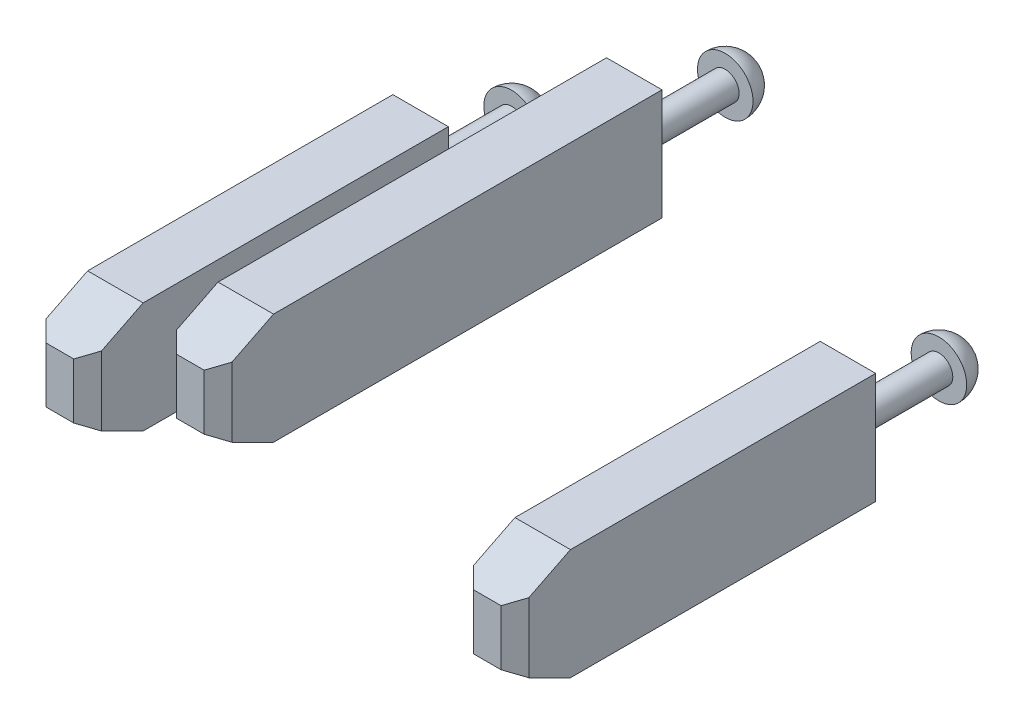
ISO-10303-21;
HEADER;
FILE_DESCRIPTION(('STEP AP214'),'2;1');
FILE_NAME('part.step','',(''),(''),'','','');
FILE_SCHEMA(('AUTOMOTIVE_DESIGN { 1 0 10303 214 1 1 1 1 }'));
ENDSEC;
DATA;
#1=APPLICATION_CONTEXT('core data for automotive mechanical design processes');
#2=APPLICATION_PROTOCOL_DEFINITION('international standard','automotive_design',2000,#1);
#3=PRODUCT_CONTEXT('',#1,'mechanical');
#4=PRODUCT('Part','Part','',(#3));
#5=PRODUCT_RELATED_PRODUCT_CATEGORY('part','',(#4));
#6=PRODUCT_DEFINITION_FORMATION('','',#4);
#7=PRODUCT_DEFINITION_CONTEXT('part definition',#1,'design');
#8=PRODUCT_DEFINITION('design','',#6,#7);
#9=PRODUCT_DEFINITION_SHAPE('','',#8);
#10=(LENGTH_UNIT() NAMED_UNIT(*) SI_UNIT(.MILLI.,.METRE.));
#11=(NAMED_UNIT(*) PLANE_ANGLE_UNIT() SI_UNIT($,.RADIAN.));
#12=(NAMED_UNIT(*) SI_UNIT($,.STERADIAN.) SOLID_ANGLE_UNIT());
#13=UNCERTAINTY_MEASURE_WITH_UNIT(LENGTH_MEASURE(1.E-05),#10,'distance_accuracy_value','');
#14=(GEOMETRIC_REPRESENTATION_CONTEXT(3) GLOBAL_UNCERTAINTY_ASSIGNED_CONTEXT((#13)) GLOBAL_UNIT_ASSIGNED_CONTEXT((#10,
#11,#12)) REPRESENTATION_CONTEXT('',''));
#15=CARTESIAN_POINT('',(0.,0.,0.));
#16=DIRECTION('',(0.,0.,1.));
#17=DIRECTION('',(1.,0.,0.));
#18=AXIS2_PLACEMENT_3D('',#15,#16,#17);
#19=CARTESIAN_POINT('',(0.,17.8125,-19.7484375));
#20=DIRECTION('',(1.,0.,0.));
#21=DIRECTION('',(0.,1.,0.));
#22=AXIS2_PLACEMENT_3D('',#19,#20,#21);
#23=SPHERICAL_SURFACE('',#22,1.);
#24=CARTESIAN_POINT('',(0.,17.8125,-19.7484375));
#25=DIRECTION('',(0.,0.,1.));
#26=DIRECTION('',(1.,0.,0.));
#27=AXIS2_PLACEMENT_3D('',#24,#25,#26);
#28=CIRCLE('',#27,1.);
#29=CARTESIAN_POINT('',(1.,17.8125,-19.7484375));
#30=VERTEX_POINT('',#29);
#31=CARTESIAN_POINT('',(-1.,17.8125,-19.7484375));
#32=VERTEX_POINT('',#31);
#33=EDGE_CURVE('P0_E32',#30,#32,#28,.T.);
#34=ORIENTED_EDGE('',*,*,#33,.F.);
#35=CARTESIAN_POINT('',(0.,17.8125,-19.7484375));
#36=DIRECTION('',(0.,0.,1.));
#37=DIRECTION('',(1.,0.,0.));
#38=AXIS2_PLACEMENT_3D('',#35,#36,#37);
#39=CIRCLE('',#38,1.);
#40=EDGE_CURVE('P0_E20',#32,#30,#39,.T.);
#41=ORIENTED_EDGE('',*,*,#40,.F.);
#42=EDGE_LOOP('',(#34,#41));
#43=FACE_BOUND('',#42,.T.);
#44=ADVANCED_FACE('P0_F16',(#43),#23,.T.);
#45=CARTESIAN_POINT('',(0.,17.8125,-19.7484375));
#46=DIRECTION('',(0.,0.,1.));
#47=DIRECTION('',(1.,0.,0.));
#48=AXIS2_PLACEMENT_3D('',#45,#46,#47);
#49=PLANE('',#48);
#50=CARTESIAN_POINT('',(0.,17.8125,-19.7484375));
#51=DIRECTION('',(0.,0.,-1.));
#52=DIRECTION('',(-1.,0.,0.));
#53=AXIS2_PLACEMENT_3D('',#50,#51,#52);
#54=CIRCLE('',#53,0.5);
#55=CARTESIAN_POINT('',(-0.5,17.8125,-19.7484375));
#56=VERTEX_POINT('',#55);
#57=EDGE_CURVE('P0_E147',#56,#56,#54,.F.);
#58=ORIENTED_EDGE('',*,*,#57,.F.);
#59=EDGE_LOOP('',(#58));
#60=FACE_BOUND('',#59,.T.);
#61=ORIENTED_EDGE('',*,*,#33,.T.);
#62=ORIENTED_EDGE('',*,*,#40,.T.);
#63=EDGE_LOOP('',(#61,#62));
#64=FACE_BOUND('',#63,.T.);
#65=ADVANCED_FACE('P0_F163',(#60,#64),#49,.T.);
#66=CARTESIAN_POINT('',(-0.75,18.8125,-0.720312500000001));
#67=DIRECTION('',(-0.707106781186548,0.,0.707106781186547));
#68=DIRECTION('',(0.707106781186547,0.,0.707106781186548));
#69=AXIS2_PLACEMENT_3D('',#66,#67,#68);
#70=PLANE('',#69);
#71=DIRECTION('',(0.666666666666667,-0.333333333333333,0.666666666666666));
#72=VECTOR('',#71,1.);
#73=CARTESIAN_POINT('',(-1.,19.0625,-0.9703125));
#74=LINE('',#73,#72);
#75=CARTESIAN_POINT('',(-1.,19.0625,-0.970312500000001));
#76=VERTEX_POINT('',#75);
#77=CARTESIAN_POINT('',(-0.5,18.8125,-0.470312500000001));
#78=VERTEX_POINT('',#77);
#79=EDGE_CURVE('P0_E142',#76,#78,#74,.T.);
#80=ORIENTED_EDGE('',*,*,#79,.F.);
#81=DIRECTION('',(0.,1.,0.));
#82=VECTOR('',#81,1.);
#83=CARTESIAN_POINT('',(-1.,19.8125,-0.970312500000001));
#84=LINE('',#83,#82);
#85=CARTESIAN_POINT('',(-1.,16.5625,-0.970312500000001));
#86=VERTEX_POINT('',#85);
#87=EDGE_CURVE('P0_E137',#86,#76,#84,.T.);
#88=ORIENTED_EDGE('',*,*,#87,.F.);
#89=DIRECTION('',(-0.666666666666667,-0.333333333333333,-0.666666666666667));
#90=VECTOR('',#89,1.);
#91=CARTESIAN_POINT('',(-0.5,16.8125,-0.4703125));
#92=LINE('',#91,#90);
#93=CARTESIAN_POINT('',(-0.5,16.8125,-0.470312500000001));
#94=VERTEX_POINT('',#93);
#95=EDGE_CURVE('P0_E150',#94,#86,#92,.T.);
#96=ORIENTED_EDGE('',*,*,#95,.F.);
#97=DIRECTION('',(0.,1.,0.));
#98=VECTOR('',#97,1.);
#99=CARTESIAN_POINT('',(-0.5,17.8125,-0.470312500000001));
#100=LINE('',#99,#98);
#101=EDGE_CURVE('P0_E156',#78,#94,#100,.F.);
#102=ORIENTED_EDGE('',*,*,#101,.F.);
#103=EDGE_LOOP('',(#80,#88,#96,#102));
#104=FACE_BOUND('',#103,.T.);
#105=ADVANCED_FACE('P0_F165',(#104),#70,.T.);
#106=CARTESIAN_POINT('',(0.,17.8125,-0.470312500000001));
#107=DIRECTION('',(0.,0.,1.));
#108=DIRECTION('',(1.,0.,0.));
#109=AXIS2_PLACEMENT_3D('',#106,#107,#108);
#110=PLANE('',#109);
#111=ORIENTED_EDGE('',*,*,#101,.T.);
#112=DIRECTION('',(1.,0.,0.));
#113=VECTOR('',#112,1.);
#114=CARTESIAN_POINT('',(-0.5,16.8125,-0.4703125));
#115=LINE('',#114,#113);
#116=CARTESIAN_POINT('',(0.5,16.8125,-0.470312500000001));
#117=VERTEX_POINT('',#116);
#118=EDGE_CURVE('P0_E153',#117,#94,#115,.F.);
#119=ORIENTED_EDGE('',*,*,#118,.F.);
#120=DIRECTION('',(0.,1.,0.));
#121=VECTOR('',#120,1.);
#122=CARTESIAN_POINT('',(0.5,16.8125,-0.470312500000001));
#123=LINE('',#122,#121);
#124=CARTESIAN_POINT('',(0.5,18.8125,-0.470312500000001));
#125=VERTEX_POINT('',#124);
#126=EDGE_CURVE('P0_E125',#125,#117,#123,.F.);
#127=ORIENTED_EDGE('',*,*,#126,.F.);
#128=DIRECTION('',(1.,0.,0.));
#129=VECTOR('',#128,1.);
#130=CARTESIAN_POINT('',(0.5,18.8125,-0.4703125));
#131=LINE('',#130,#129);
#132=EDGE_CURVE('P0_E140',#78,#125,#131,.T.);
#133=ORIENTED_EDGE('',*,*,#132,.F.);
#134=EDGE_LOOP('',(#111,#119,#127,#133));
#135=FACE_BOUND('',#134,.T.);
#136=ADVANCED_FACE('P0_F172',(#135),#110,.T.);
#137=CARTESIAN_POINT('',(-0.5,16.3125,-1.4703125));
#138=DIRECTION('',(0.,-0.894427190999916,0.447213595499958));
#139=DIRECTION('',(0.,-0.447213595499958,-0.894427190999916));
#140=AXIS2_PLACEMENT_3D('',#137,#138,#139);
#141=PLANE('',#140);
#142=DIRECTION('',(1.,0.,0.));
#143=VECTOR('',#142,1.);
#144=CARTESIAN_POINT('',(-1.,15.8125,-2.4703125));
#145=LINE('',#144,#143);
#146=CARTESIAN_POINT('',(1.,15.8125,-2.4703125));
#147=VERTEX_POINT('',#146);
#148=CARTESIAN_POINT('',(-1.,15.8125,-2.4703125));
#149=VERTEX_POINT('',#148);
#150=EDGE_CURVE('P0_E119',#147,#149,#145,.F.);
#151=ORIENTED_EDGE('',*,*,#150,.F.);
#152=DIRECTION('',(0.,-0.447213595499958,-0.894427190999916));
#153=VECTOR('',#152,1.);
#154=CARTESIAN_POINT('',(1.,16.3125,-1.4703125));
#155=LINE('',#154,#153);
#156=CARTESIAN_POINT('',(1.,16.5625,-0.970312500000001));
#157=VERTEX_POINT('',#156);
#158=EDGE_CURVE('P0_E148',#147,#157,#155,.F.);
#159=ORIENTED_EDGE('',*,*,#158,.T.);
#160=DIRECTION('',(0.666666666666666,-0.333333333333334,-0.666666666666667));
#161=VECTOR('',#160,1.);
#162=CARTESIAN_POINT('',(0.5,16.8125,-0.470312500000001));
#163=LINE('',#162,#161);
#164=EDGE_CURVE('P0_E122',#117,#157,#163,.T.);
#165=ORIENTED_EDGE('',*,*,#164,.F.);
#166=ORIENTED_EDGE('',*,*,#118,.T.);
#167=ORIENTED_EDGE('',*,*,#95,.T.);
#168=DIRECTION('',(0.,0.447213595499958,0.894427190999916));
#169=VECTOR('',#168,1.);
#170=CARTESIAN_POINT('',(-1.,15.8125,-2.4703125));
#171=LINE('',#170,#169);
#172=EDGE_CURVE('P0_E131',#149,#86,#171,.T.);
#173=ORIENTED_EDGE('',*,*,#172,.F.);
#174=EDGE_LOOP('',(#151,#159,#165,#166,#167,#173));
#175=FACE_BOUND('',#174,.T.);
#176=ADVANCED_FACE('P0_F205',(#175),#141,.T.);
#177=CARTESIAN_POINT('',(0.,17.8125,-16.4703125));
#178=DIRECTION('',(0.,0.,-1.));
#179=DIRECTION('',(-1.,0.,0.));
#180=AXIS2_PLACEMENT_3D('',#177,#178,#179);
#181=CYLINDRICAL_SURFACE('',#180,0.5);
#182=CARTESIAN_POINT('',(0.,17.8125,-16.4703125));
#183=DIRECTION('',(0.,0.,-1.));
#184=DIRECTION('',(-1.,0.,0.));
#185=AXIS2_PLACEMENT_3D('',#182,#183,#184);
#186=CIRCLE('',#185,0.5);
#187=CARTESIAN_POINT('',(-0.5,17.8125,-16.4703125));
#188=VERTEX_POINT('',#187);
#189=EDGE_CURVE('P0_E112',#188,#188,#186,.T.);
#190=ORIENTED_EDGE('',*,*,#189,.T.);
#191=EDGE_LOOP('',(#190));
#192=FACE_BOUND('',#191,.T.);
#193=ORIENTED_EDGE('',*,*,#57,.T.);
#194=EDGE_LOOP('',(#193));
#195=FACE_BOUND('',#194,.T.);
#196=ADVANCED_FACE('P0_F201',(#192,#195),#181,.T.);
#197=CARTESIAN_POINT('',(0.5,19.3125,-1.4703125));
#198=DIRECTION('',(0.,0.894427190999916,0.447213595499958));
#199=DIRECTION('',(0.,-0.447213595499958,0.894427190999916));
#200=AXIS2_PLACEMENT_3D('',#197,#198,#199);
#201=PLANE('',#200);
#202=ORIENTED_EDGE('',*,*,#79,.T.);
#203=ORIENTED_EDGE('',*,*,#132,.T.);
#204=DIRECTION('',(-0.666666666666666,-0.333333333333334,0.666666666666667));
#205=VECTOR('',#204,1.);
#206=CARTESIAN_POINT('',(1.,19.0625,-0.970312500000001));
#207=LINE('',#206,#205);
#208=CARTESIAN_POINT('',(1.,19.0625,-0.9703125));
#209=VERTEX_POINT('',#208);
#210=EDGE_CURVE('P0_E128',#209,#125,#207,.T.);
#211=ORIENTED_EDGE('',*,*,#210,.F.);
#212=DIRECTION('',(0.,-0.447213595499958,0.894427190999916));
#213=VECTOR('',#212,1.);
#214=CARTESIAN_POINT('',(1.,19.3125,-1.4703125));
#215=LINE('',#214,#213);
#216=CARTESIAN_POINT('',(1.,19.8125,-2.4703125));
#217=VERTEX_POINT('',#216);
#218=EDGE_CURVE('P0_E145',#209,#217,#215,.F.);
#219=ORIENTED_EDGE('',*,*,#218,.T.);
#220=DIRECTION('',(1.,0.,0.));
#221=VECTOR('',#220,1.);
#222=CARTESIAN_POINT('',(1.,19.8125,-2.4703125));
#223=LINE('',#222,#221);
#224=CARTESIAN_POINT('',(-1.,19.8125,-2.4703125));
#225=VERTEX_POINT('',#224);
#226=EDGE_CURVE('P0_E96',#225,#217,#223,.T.);
#227=ORIENTED_EDGE('',*,*,#226,.F.);
#228=DIRECTION('',(0.,0.447213595499958,-0.894427190999916));
#229=VECTOR('',#228,1.);
#230=CARTESIAN_POINT('',(-1.,19.0625,-0.970312500000001));
#231=LINE('',#230,#229);
#232=EDGE_CURVE('P0_E134',#76,#225,#231,.T.);
#233=ORIENTED_EDGE('',*,*,#232,.F.);
#234=EDGE_LOOP('',(#202,#203,#211,#219,#227,#233));
#235=FACE_BOUND('',#234,.T.);
#236=ADVANCED_FACE('P0_F197',(#235),#201,.T.);
#237=CARTESIAN_POINT('',(-1.,19.8125,-16.4703125));
#238=DIRECTION('',(-1.,0.,0.));
#239=DIRECTION('',(0.,0.,1.));
#240=AXIS2_PLACEMENT_3D('',#237,#238,#239);
#241=PLANE('',#240);
#242=DIRECTION('',(0.,0.,-1.));
#243=VECTOR('',#242,1.);
#244=CARTESIAN_POINT('',(-1.,15.8125,-16.4703125));
#245=LINE('',#244,#243);
#246=CARTESIAN_POINT('',(-1.,15.8125,-16.4703125));
#247=VERTEX_POINT('',#246);
#248=EDGE_CURVE('P0_E116',#149,#247,#245,.T.);
#249=ORIENTED_EDGE('',*,*,#248,.F.);
#250=ORIENTED_EDGE('',*,*,#172,.T.);
#251=ORIENTED_EDGE('',*,*,#87,.T.);
#252=ORIENTED_EDGE('',*,*,#232,.T.);
#253=DIRECTION('',(0.,0.,1.));
#254=VECTOR('',#253,1.);
#255=CARTESIAN_POINT('',(-1.,19.8125,-16.4703125));
#256=LINE('',#255,#254);
#257=CARTESIAN_POINT('',(-1.,19.8125,-16.4703125));
#258=VERTEX_POINT('',#257);
#259=EDGE_CURVE('P0_E95',#258,#225,#256,.T.);
#260=ORIENTED_EDGE('',*,*,#259,.F.);
#261=DIRECTION('',(0.,1.,0.));
#262=VECTOR('',#261,1.);
#263=CARTESIAN_POINT('',(-1.,17.8125,-16.4703125));
#264=LINE('',#263,#262);
#265=EDGE_CURVE('P0_E91',#258,#247,#264,.F.);
#266=ORIENTED_EDGE('',*,*,#265,.T.);
#267=EDGE_LOOP('',(#249,#250,#251,#252,#260,#266));
#268=FACE_BOUND('',#267,.T.);
#269=ADVANCED_FACE('P0_F193',(#268),#241,.T.);
#270=CARTESIAN_POINT('',(0.75,16.8125,-0.720312500000001));
#271=DIRECTION('',(0.707106781186548,0.,0.707106781186547));
#272=DIRECTION('',(0.707106781186547,0.,-0.707106781186548));
#273=AXIS2_PLACEMENT_3D('',#270,#271,#272);
#274=PLANE('',#273);
#275=ORIENTED_EDGE('',*,*,#164,.T.);
#276=DIRECTION('',(0.,1.,0.));
#277=VECTOR('',#276,1.);
#278=CARTESIAN_POINT('',(1.,15.8125,-0.970312500000001));
#279=LINE('',#278,#277);
#280=EDGE_CURVE('P0_E105',#209,#157,#279,.F.);
#281=ORIENTED_EDGE('',*,*,#280,.F.);
#282=ORIENTED_EDGE('',*,*,#210,.T.);
#283=ORIENTED_EDGE('',*,*,#126,.T.);
#284=EDGE_LOOP('',(#275,#281,#282,#283));
#285=FACE_BOUND('',#284,.T.);
#286=ADVANCED_FACE('P0_F189',(#285),#274,.T.);
#287=CARTESIAN_POINT('',(-1.,15.8125,-16.4703125));
#288=DIRECTION('',(0.,-1.,0.));
#289=DIRECTION('',(0.,0.,-1.));
#290=AXIS2_PLACEMENT_3D('',#287,#288,#289);
#291=PLANE('',#290);
#292=DIRECTION('',(1.,0.,0.));
#293=VECTOR('',#292,1.);
#294=CARTESIAN_POINT('',(0.,15.8125,-16.4703125));
#295=LINE('',#294,#293);
#296=CARTESIAN_POINT('',(1.,15.8125,-16.4703125));
#297=VERTEX_POINT('',#296);
#298=EDGE_CURVE('P0_E113',#247,#297,#295,.T.);
#299=ORIENTED_EDGE('',*,*,#298,.T.);
#300=DIRECTION('',(0.,0.,-1.));
#301=VECTOR('',#300,1.);
#302=CARTESIAN_POINT('',(1.,15.8125,-16.4703125));
#303=LINE('',#302,#301);
#304=EDGE_CURVE('P0_E103',#147,#297,#303,.T.);
#305=ORIENTED_EDGE('',*,*,#304,.F.);
#306=ORIENTED_EDGE('',*,*,#150,.T.);
#307=ORIENTED_EDGE('',*,*,#248,.T.);
#308=EDGE_LOOP('',(#299,#305,#306,#307));
#309=FACE_BOUND('',#308,.T.);
#310=ADVANCED_FACE('P0_F185',(#309),#291,.T.);
#311=CARTESIAN_POINT('',(0.,17.8125,-16.4703125));
#312=DIRECTION('',(0.,0.,1.));
#313=DIRECTION('',(1.,0.,0.));
#314=AXIS2_PLACEMENT_3D('',#311,#312,#313);
#315=PLANE('',#314);
#316=ORIENTED_EDGE('',*,*,#189,.F.);
#317=EDGE_LOOP('',(#316));
#318=FACE_BOUND('',#317,.T.);
#319=ORIENTED_EDGE('',*,*,#265,.F.);
#320=DIRECTION('',(1.,0.,0.));
#321=VECTOR('',#320,1.);
#322=CARTESIAN_POINT('',(1.,19.8125,-16.4703125));
#323=LINE('',#322,#321);
#324=CARTESIAN_POINT('',(1.,19.8125,-16.4703125));
#325=VERTEX_POINT('',#324);
#326=EDGE_CURVE('P0_E85',#325,#258,#323,.F.);
#327=ORIENTED_EDGE('',*,*,#326,.F.);
#328=DIRECTION('',(0.,1.,0.));
#329=VECTOR('',#328,1.);
#330=CARTESIAN_POINT('',(1.,15.8125,-16.4703125));
#331=LINE('',#330,#329);
#332=EDGE_CURVE('P0_E25',#297,#325,#331,.T.);
#333=ORIENTED_EDGE('',*,*,#332,.F.);
#334=ORIENTED_EDGE('',*,*,#298,.F.);
#335=EDGE_LOOP('',(#319,#327,#333,#334));
#336=FACE_BOUND('',#335,.T.);
#337=ADVANCED_FACE('P0_F87',(#318,#336),#315,.F.);
#338=CARTESIAN_POINT('',(1.,19.8125,-16.4703125));
#339=DIRECTION('',(0.,1.,0.));
#340=DIRECTION('',(0.,0.,1.));
#341=AXIS2_PLACEMENT_3D('',#338,#339,#340);
#342=PLANE('',#341);
#343=ORIENTED_EDGE('',*,*,#326,.T.);
#344=ORIENTED_EDGE('',*,*,#259,.T.);
#345=ORIENTED_EDGE('',*,*,#226,.T.);
#346=DIRECTION('',(0.,0.,-1.));
#347=VECTOR('',#346,1.);
#348=CARTESIAN_POINT('',(1.,19.8125,-16.4703125));
#349=LINE('',#348,#347);
#350=EDGE_CURVE('P0_E11',#325,#217,#349,.F.);
#351=ORIENTED_EDGE('',*,*,#350,.F.);
#352=EDGE_LOOP('',(#343,#344,#345,#351));
#353=FACE_BOUND('',#352,.T.);
#354=ADVANCED_FACE('P0_F99',(#353),#342,.T.);
#355=CARTESIAN_POINT('',(1.,15.8125,-16.4703125));
#356=DIRECTION('',(1.,0.,0.));
#357=DIRECTION('',(0.,0.,-1.));
#358=AXIS2_PLACEMENT_3D('',#355,#356,#357);
#359=PLANE('',#358);
#360=ORIENTED_EDGE('',*,*,#350,.T.);
#361=ORIENTED_EDGE('',*,*,#218,.F.);
#362=ORIENTED_EDGE('',*,*,#280,.T.);
#363=ORIENTED_EDGE('',*,*,#158,.F.);
#364=ORIENTED_EDGE('',*,*,#304,.T.);
#365=ORIENTED_EDGE('',*,*,#332,.T.);
#366=EDGE_LOOP('',(#360,#361,#362,#363,#364,#365));
#367=FACE_BOUND('',#366,.T.);
#368=ADVANCED_FACE('P0_F101',(#367),#359,.T.);
#369=CLOSED_SHELL('',(#44,#65,#105,#136,#176,#196,#236,#269,#286,#310,#337,#354,#368));
#370=MANIFOLD_SOLID_BREP('P0_B1',#369);
#371=CARTESIAN_POINT('',(-7.7,12.8125,-19.7484375));
#372=DIRECTION('',(1.,0.,0.));
#373=DIRECTION('',(0.,1.,0.));
#374=AXIS2_PLACEMENT_3D('',#371,#372,#373);
#375=SPHERICAL_SURFACE('',#374,1.);
#376=CARTESIAN_POINT('',(-7.7,12.8125,-19.7484375));
#377=DIRECTION('',(0.,0.,1.));
#378=DIRECTION('',(1.,0.,0.));
#379=AXIS2_PLACEMENT_3D('',#376,#377,#378);
#380=CIRCLE('',#379,1.);
#381=CARTESIAN_POINT('',(-6.7,12.8125,-19.7484375));
#382=VERTEX_POINT('',#381);
#383=CARTESIAN_POINT('',(-8.7,12.8125,-19.7484375));
#384=VERTEX_POINT('',#383);
#385=EDGE_CURVE('P1_E32',#382,#384,#380,.T.);
#386=ORIENTED_EDGE('',*,*,#385,.F.);
#387=CARTESIAN_POINT('',(-7.7,12.8125,-19.7484375));
#388=DIRECTION('',(0.,0.,-1.));
#389=DIRECTION('',(1.,0.,0.));
#390=AXIS2_PLACEMENT_3D('',#387,#388,#389);
#391=CIRCLE('',#390,1.);
#392=EDGE_CURVE('P1_E20',#384,#382,#391,.F.);
#393=ORIENTED_EDGE('',*,*,#392,.F.);
#394=EDGE_LOOP('',(#386,#393));
#395=FACE_BOUND('',#394,.T.);
#396=ADVANCED_FACE('P1_F16',(#395),#375,.T.);
#397=CARTESIAN_POINT('',(-7.7,12.8125,-19.7484375));
#398=DIRECTION('',(0.,0.,1.));
#399=DIRECTION('',(1.,0.,0.));
#400=AXIS2_PLACEMENT_3D('',#397,#398,#399);
#401=PLANE('',#400);
#402=CARTESIAN_POINT('',(-7.7,12.8125,-19.7484375));
#403=DIRECTION('',(0.,0.,-1.));
#404=DIRECTION('',(-1.,0.,0.));
#405=AXIS2_PLACEMENT_3D('',#402,#403,#404);
#406=CIRCLE('',#405,0.5);
#407=CARTESIAN_POINT('',(-8.2,12.8125,-19.7484375));
#408=VERTEX_POINT('',#407);
#409=EDGE_CURVE('P1_E147',#408,#408,#406,.F.);
#410=ORIENTED_EDGE('',*,*,#409,.F.);
#411=EDGE_LOOP('',(#410));
#412=FACE_BOUND('',#411,.T.);
#413=ORIENTED_EDGE('',*,*,#385,.T.);
#414=ORIENTED_EDGE('',*,*,#392,.T.);
#415=EDGE_LOOP('',(#413,#414));
#416=FACE_BOUND('',#415,.T.);
#417=ADVANCED_FACE('P1_F163',(#412,#416),#401,.T.);
#418=CARTESIAN_POINT('',(-6.95,11.8125,-3.7203125));
#419=DIRECTION('',(0.707106781186548,0.,0.707106781186548));
#420=DIRECTION('',(0.707106781186548,0.,-0.707106781186548));
#421=AXIS2_PLACEMENT_3D('',#418,#419,#420);
#422=PLANE('',#421);
#423=DIRECTION('',(-0.666666666666667,0.333333333333333,0.666666666666667));
#424=VECTOR('',#423,1.);
#425=CARTESIAN_POINT('',(-6.7,11.5625,-3.9703125));
#426=LINE('',#425,#424);
#427=CARTESIAN_POINT('',(-6.7,11.5625,-3.9703125));
#428=VERTEX_POINT('',#427);
#429=CARTESIAN_POINT('',(-7.2,11.8125,-3.4703125));
#430=VERTEX_POINT('',#429);
#431=EDGE_CURVE('P1_E142',#428,#430,#426,.T.);
#432=ORIENTED_EDGE('',*,*,#431,.F.);
#433=DIRECTION('',(0.,1.,0.));
#434=VECTOR('',#433,1.);
#435=CARTESIAN_POINT('',(-6.7,10.8125,-3.9703125));
#436=LINE('',#435,#434);
#437=CARTESIAN_POINT('',(-6.7,14.0625,-3.9703125));
#438=VERTEX_POINT('',#437);
#439=EDGE_CURVE('P1_E137',#438,#428,#436,.F.);
#440=ORIENTED_EDGE('',*,*,#439,.F.);
#441=DIRECTION('',(0.666666666666667,0.333333333333333,-0.666666666666667));
#442=VECTOR('',#441,1.);
#443=CARTESIAN_POINT('',(-7.2,13.8125,-3.4703125));
#444=LINE('',#443,#442);
#445=CARTESIAN_POINT('',(-7.2,13.8125,-3.4703125));
#446=VERTEX_POINT('',#445);
#447=EDGE_CURVE('P1_E150',#446,#438,#444,.T.);
#448=ORIENTED_EDGE('',*,*,#447,.F.);
#449=DIRECTION('',(0.,1.,0.));
#450=VECTOR('',#449,1.);
#451=CARTESIAN_POINT('',(-7.2,12.8125,-3.4703125));
#452=LINE('',#451,#450);
#453=EDGE_CURVE('P1_E156',#430,#446,#452,.T.);
#454=ORIENTED_EDGE('',*,*,#453,.F.);
#455=EDGE_LOOP('',(#432,#440,#448,#454));
#456=FACE_BOUND('',#455,.T.);
#457=ADVANCED_FACE('P1_F165',(#456),#422,.T.);
#458=CARTESIAN_POINT('',(-7.7,12.8125,-3.4703125));
#459=DIRECTION('',(0.,0.,1.));
#460=DIRECTION('',(1.,0.,0.));
#461=AXIS2_PLACEMENT_3D('',#458,#459,#460);
#462=PLANE('',#461);
#463=ORIENTED_EDGE('',*,*,#453,.T.);
#464=DIRECTION('',(1.,0.,0.));
#465=VECTOR('',#464,1.);
#466=CARTESIAN_POINT('',(-7.2,13.8125,-3.4703125));
#467=LINE('',#466,#465);
#468=CARTESIAN_POINT('',(-8.2,13.8125,-3.4703125));
#469=VERTEX_POINT('',#468);
#470=EDGE_CURVE('P1_E153',#469,#446,#467,.T.);
#471=ORIENTED_EDGE('',*,*,#470,.F.);
#472=DIRECTION('',(0.,1.,0.));
#473=VECTOR('',#472,1.);
#474=CARTESIAN_POINT('',(-8.2,13.8125,-3.4703125));
#475=LINE('',#474,#473);
#476=CARTESIAN_POINT('',(-8.2,11.8125,-3.4703125));
#477=VERTEX_POINT('',#476);
#478=EDGE_CURVE('P1_E125',#477,#469,#475,.T.);
#479=ORIENTED_EDGE('',*,*,#478,.F.);
#480=DIRECTION('',(1.,0.,0.));
#481=VECTOR('',#480,1.);
#482=CARTESIAN_POINT('',(-8.2,11.8125,-3.4703125));
#483=LINE('',#482,#481);
#484=EDGE_CURVE('P1_E140',#430,#477,#483,.F.);
#485=ORIENTED_EDGE('',*,*,#484,.F.);
#486=EDGE_LOOP('',(#463,#471,#479,#485));
#487=FACE_BOUND('',#486,.T.);
#488=ADVANCED_FACE('P1_F172',(#487),#462,.T.);
#489=CARTESIAN_POINT('',(-7.2,14.3125,-4.4703125));
#490=DIRECTION('',(0.,0.894427190999916,0.447213595499958));
#491=DIRECTION('',(0.,-0.447213595499958,0.894427190999916));
#492=AXIS2_PLACEMENT_3D('',#489,#490,#491);
#493=PLANE('',#492);
#494=DIRECTION('',(1.,0.,0.));
#495=VECTOR('',#494,1.);
#496=CARTESIAN_POINT('',(-6.7,14.8125,-5.4703125));
#497=LINE('',#496,#495);
#498=CARTESIAN_POINT('',(-8.7,14.8125,-5.4703125));
#499=VERTEX_POINT('',#498);
#500=CARTESIAN_POINT('',(-6.7,14.8125,-5.4703125));
#501=VERTEX_POINT('',#500);
#502=EDGE_CURVE('P1_E119',#499,#501,#497,.T.);
#503=ORIENTED_EDGE('',*,*,#502,.F.);
#504=DIRECTION('',(0.,-0.447213595499958,0.894427190999916));
#505=VECTOR('',#504,1.);
#506=CARTESIAN_POINT('',(-8.7,14.3125,-4.4703125));
#507=LINE('',#506,#505);
#508=CARTESIAN_POINT('',(-8.7,14.0625,-3.9703125));
#509=VERTEX_POINT('',#508);
#510=EDGE_CURVE('P1_E148',#499,#509,#507,.T.);
#511=ORIENTED_EDGE('',*,*,#510,.T.);
#512=DIRECTION('',(-0.666666666666667,0.333333333333333,-0.666666666666666));
#513=VECTOR('',#512,1.);
#514=CARTESIAN_POINT('',(-8.2,13.8125,-3.4703125));
#515=LINE('',#514,#513);
#516=EDGE_CURVE('P1_E122',#469,#509,#515,.T.);
#517=ORIENTED_EDGE('',*,*,#516,.F.);
#518=ORIENTED_EDGE('',*,*,#470,.T.);
#519=ORIENTED_EDGE('',*,*,#447,.T.);
#520=DIRECTION('',(0.,-0.447213595499958,0.894427190999916));
#521=VECTOR('',#520,1.);
#522=CARTESIAN_POINT('',(-6.7,14.8125,-5.4703125));
#523=LINE('',#522,#521);
#524=EDGE_CURVE('P1_E131',#501,#438,#523,.T.);
#525=ORIENTED_EDGE('',*,*,#524,.F.);
#526=EDGE_LOOP('',(#503,#511,#517,#518,#519,#525));
#527=FACE_BOUND('',#526,.T.);
#528=ADVANCED_FACE('P1_F205',(#527),#493,.T.);
#529=CARTESIAN_POINT('',(-7.7,12.8125,-16.4703125));
#530=DIRECTION('',(0.,0.,-1.));
#531=DIRECTION('',(-1.,0.,0.));
#532=AXIS2_PLACEMENT_3D('',#529,#530,#531);
#533=CYLINDRICAL_SURFACE('',#532,0.5);
#534=CARTESIAN_POINT('',(-7.7,12.8125,-16.4703125));
#535=DIRECTION('',(0.,0.,-1.));
#536=DIRECTION('',(-1.,0.,0.));
#537=AXIS2_PLACEMENT_3D('',#534,#535,#536);
#538=CIRCLE('',#537,0.5);
#539=CARTESIAN_POINT('',(-8.2,12.8125,-16.4703125));
#540=VERTEX_POINT('',#539);
#541=EDGE_CURVE('P1_E112',#540,#540,#538,.T.);
#542=ORIENTED_EDGE('',*,*,#541,.T.);
#543=EDGE_LOOP('',(#542));
#544=FACE_BOUND('',#543,.T.);
#545=ORIENTED_EDGE('',*,*,#409,.T.);
#546=EDGE_LOOP('',(#545));
#547=FACE_BOUND('',#546,.T.);
#548=ADVANCED_FACE('P1_F201',(#544,#547),#533,.T.);
#549=CARTESIAN_POINT('',(-8.2,11.3125,-4.4703125));
#550=DIRECTION('',(0.,-0.894427190999916,0.447213595499958));
#551=DIRECTION('',(0.,-0.447213595499958,-0.894427190999916));
#552=AXIS2_PLACEMENT_3D('',#549,#550,#551);
#553=PLANE('',#552);
#554=ORIENTED_EDGE('',*,*,#431,.T.);
#555=ORIENTED_EDGE('',*,*,#484,.T.);
#556=DIRECTION('',(0.666666666666667,0.333333333333333,0.666666666666666));
#557=VECTOR('',#556,1.);
#558=CARTESIAN_POINT('',(-8.7,11.5625,-3.9703125));
#559=LINE('',#558,#557);
#560=CARTESIAN_POINT('',(-8.7,11.5625,-3.9703125));
#561=VERTEX_POINT('',#560);
#562=EDGE_CURVE('P1_E128',#561,#477,#559,.T.);
#563=ORIENTED_EDGE('',*,*,#562,.F.);
#564=DIRECTION('',(0.,-0.447213595499958,-0.894427190999916));
#565=VECTOR('',#564,1.);
#566=CARTESIAN_POINT('',(-8.7,11.3125,-4.4703125));
#567=LINE('',#566,#565);
#568=CARTESIAN_POINT('',(-8.7,10.8125,-5.4703125));
#569=VERTEX_POINT('',#568);
#570=EDGE_CURVE('P1_E145',#561,#569,#567,.T.);
#571=ORIENTED_EDGE('',*,*,#570,.T.);
#572=DIRECTION('',(1.,0.,0.));
#573=VECTOR('',#572,1.);
#574=CARTESIAN_POINT('',(-8.7,10.8125,-5.4703125));
#575=LINE('',#574,#573);
#576=CARTESIAN_POINT('',(-6.7,10.8125,-5.4703125));
#577=VERTEX_POINT('',#576);
#578=EDGE_CURVE('P1_E96',#577,#569,#575,.F.);
#579=ORIENTED_EDGE('',*,*,#578,.F.);
#580=DIRECTION('',(0.,-0.447213595499957,-0.894427190999916));
#581=VECTOR('',#580,1.);
#582=CARTESIAN_POINT('',(-6.7,11.5625,-3.9703125));
#583=LINE('',#582,#581);
#584=EDGE_CURVE('P1_E134',#428,#577,#583,.T.);
#585=ORIENTED_EDGE('',*,*,#584,.F.);
#586=EDGE_LOOP('',(#554,#555,#563,#571,#579,#585));
#587=FACE_BOUND('',#586,.T.);
#588=ADVANCED_FACE('P1_F197',(#587),#553,.T.);
#589=CARTESIAN_POINT('',(-6.7,10.8125,-16.4703125));
#590=DIRECTION('',(1.,0.,0.));
#591=DIRECTION('',(0.,0.,-1.));
#592=AXIS2_PLACEMENT_3D('',#589,#590,#591);
#593=PLANE('',#592);
#594=DIRECTION('',(0.,0.,1.));
#595=VECTOR('',#594,1.);
#596=CARTESIAN_POINT('',(-6.7,14.8125,-16.4703125));
#597=LINE('',#596,#595);
#598=CARTESIAN_POINT('',(-6.7,14.8125,-16.4703125));
#599=VERTEX_POINT('',#598);
#600=EDGE_CURVE('P1_E116',#501,#599,#597,.F.);
#601=ORIENTED_EDGE('',*,*,#600,.F.);
#602=ORIENTED_EDGE('',*,*,#524,.T.);
#603=ORIENTED_EDGE('',*,*,#439,.T.);
#604=ORIENTED_EDGE('',*,*,#584,.T.);
#605=DIRECTION('',(0.,0.,-1.));
#606=VECTOR('',#605,1.);
#607=CARTESIAN_POINT('',(-6.7,10.8125,-16.4703125));
#608=LINE('',#607,#606);
#609=CARTESIAN_POINT('',(-6.7,10.8125,-16.4703125));
#610=VERTEX_POINT('',#609);
#611=EDGE_CURVE('P1_E95',#610,#577,#608,.F.);
#612=ORIENTED_EDGE('',*,*,#611,.F.);
#613=DIRECTION('',(0.,1.,0.));
#614=VECTOR('',#613,1.);
#615=CARTESIAN_POINT('',(-6.7,12.8125,-16.4703125));
#616=LINE('',#615,#614);
#617=EDGE_CURVE('P1_E91',#610,#599,#616,.T.);
#618=ORIENTED_EDGE('',*,*,#617,.T.);
#619=EDGE_LOOP('',(#601,#602,#603,#604,#612,#618));
#620=FACE_BOUND('',#619,.T.);
#621=ADVANCED_FACE('P1_F193',(#620),#593,.T.);
#622=CARTESIAN_POINT('',(-8.45,13.8125,-3.7203125));
#623=DIRECTION('',(-0.707106781186548,0.,0.707106781186548));
#624=DIRECTION('',(0.707106781186548,0.,0.707106781186548));
#625=AXIS2_PLACEMENT_3D('',#622,#623,#624);
#626=PLANE('',#625);
#627=ORIENTED_EDGE('',*,*,#516,.T.);
#628=DIRECTION('',(0.,1.,0.));
#629=VECTOR('',#628,1.);
#630=CARTESIAN_POINT('',(-8.7,14.8125,-3.9703125));
#631=LINE('',#630,#629);
#632=EDGE_CURVE('P1_E105',#561,#509,#631,.T.);
#633=ORIENTED_EDGE('',*,*,#632,.F.);
#634=ORIENTED_EDGE('',*,*,#562,.T.);
#635=ORIENTED_EDGE('',*,*,#478,.T.);
#636=EDGE_LOOP('',(#627,#633,#634,#635));
#637=FACE_BOUND('',#636,.T.);
#638=ADVANCED_FACE('P1_F189',(#637),#626,.T.);
#639=CARTESIAN_POINT('',(-6.7,14.8125,-16.4703125));
#640=DIRECTION('',(0.,1.,0.));
#641=DIRECTION('',(0.,0.,1.));
#642=AXIS2_PLACEMENT_3D('',#639,#640,#641);
#643=PLANE('',#642);
#644=DIRECTION('',(1.,0.,0.));
#645=VECTOR('',#644,1.);
#646=CARTESIAN_POINT('',(-7.7,14.8125,-16.4703125));
#647=LINE('',#646,#645);
#648=CARTESIAN_POINT('',(-8.7,14.8125,-16.4703125));
#649=VERTEX_POINT('',#648);
#650=EDGE_CURVE('P1_E113',#599,#649,#647,.F.);
#651=ORIENTED_EDGE('',*,*,#650,.T.);
#652=DIRECTION('',(0.,0.,1.));
#653=VECTOR('',#652,1.);
#654=CARTESIAN_POINT('',(-8.7,14.8125,-16.4703125));
#655=LINE('',#654,#653);
#656=EDGE_CURVE('P1_E103',#499,#649,#655,.F.);
#657=ORIENTED_EDGE('',*,*,#656,.F.);
#658=ORIENTED_EDGE('',*,*,#502,.T.);
#659=ORIENTED_EDGE('',*,*,#600,.T.);
#660=EDGE_LOOP('',(#651,#657,#658,#659));
#661=FACE_BOUND('',#660,.T.);
#662=ADVANCED_FACE('P1_F185',(#661),#643,.T.);
#663=CARTESIAN_POINT('',(-7.7,12.8125,-16.4703125));
#664=DIRECTION('',(0.,0.,1.));
#665=DIRECTION('',(1.,0.,0.));
#666=AXIS2_PLACEMENT_3D('',#663,#664,#665);
#667=PLANE('',#666);
#668=ORIENTED_EDGE('',*,*,#541,.F.);
#669=EDGE_LOOP('',(#668));
#670=FACE_BOUND('',#669,.T.);
#671=DIRECTION('',(0.,1.,0.));
#672=VECTOR('',#671,1.);
#673=CARTESIAN_POINT('',(-8.7,14.8125,-16.4703125));
#674=LINE('',#673,#672);
#675=CARTESIAN_POINT('',(-8.7,10.8125,-16.4703125));
#676=VERTEX_POINT('',#675);
#677=EDGE_CURVE('P1_E25',#649,#676,#674,.F.);
#678=ORIENTED_EDGE('',*,*,#677,.F.);
#679=ORIENTED_EDGE('',*,*,#650,.F.);
#680=ORIENTED_EDGE('',*,*,#617,.F.);
#681=DIRECTION('',(1.,0.,0.));
#682=VECTOR('',#681,1.);
#683=CARTESIAN_POINT('',(-8.7,10.8125,-16.4703125));
#684=LINE('',#683,#682);
#685=EDGE_CURVE('P1_E85',#676,#610,#684,.T.);
#686=ORIENTED_EDGE('',*,*,#685,.F.);
#687=EDGE_LOOP('',(#678,#679,#680,#686));
#688=FACE_BOUND('',#687,.T.);
#689=ADVANCED_FACE('P1_F87',(#670,#688),#667,.F.);
#690=CARTESIAN_POINT('',(-8.7,10.8125,-16.4703125));
#691=DIRECTION('',(0.,-1.,0.));
#692=DIRECTION('',(0.,0.,-1.));
#693=AXIS2_PLACEMENT_3D('',#690,#691,#692);
#694=PLANE('',#693);
#695=ORIENTED_EDGE('',*,*,#685,.T.);
#696=ORIENTED_EDGE('',*,*,#611,.T.);
#697=ORIENTED_EDGE('',*,*,#578,.T.);
#698=DIRECTION('',(0.,0.,1.));
#699=VECTOR('',#698,1.);
#700=CARTESIAN_POINT('',(-8.7,10.8125,-16.4703125));
#701=LINE('',#700,#699);
#702=EDGE_CURVE('P1_E11',#676,#569,#701,.T.);
#703=ORIENTED_EDGE('',*,*,#702,.F.);
#704=EDGE_LOOP('',(#695,#696,#697,#703));
#705=FACE_BOUND('',#704,.T.);
#706=ADVANCED_FACE('P1_F99',(#705),#694,.T.);
#707=CARTESIAN_POINT('',(-8.7,14.8125,-16.4703125));
#708=DIRECTION('',(-1.,0.,0.));
#709=DIRECTION('',(0.,0.,1.));
#710=AXIS2_PLACEMENT_3D('',#707,#708,#709);
#711=PLANE('',#710);
#712=ORIENTED_EDGE('',*,*,#702,.T.);
#713=ORIENTED_EDGE('',*,*,#570,.F.);
#714=ORIENTED_EDGE('',*,*,#632,.T.);
#715=ORIENTED_EDGE('',*,*,#510,.F.);
#716=ORIENTED_EDGE('',*,*,#656,.T.);
#717=ORIENTED_EDGE('',*,*,#677,.T.);
#718=EDGE_LOOP('',(#712,#713,#714,#715,#716,#717));
#719=FACE_BOUND('',#718,.T.);
#720=ADVANCED_FACE('P1_F101',(#719),#711,.T.);
#721=CLOSED_SHELL('',(#396,#417,#457,#488,#528,#548,#588,#621,#638,#662,#689,#706,#720));
#722=MANIFOLD_SOLID_BREP('P1_B1',#721);
#723=CARTESIAN_POINT('',(7.7,12.8125,-19.7484375));
#724=DIRECTION('',(1.,0.,0.));
#725=DIRECTION('',(0.,1.,0.));
#726=AXIS2_PLACEMENT_3D('',#723,#724,#725);
#727=SPHERICAL_SURFACE('',#726,1.);
#728=CARTESIAN_POINT('',(7.7,12.8125,-19.7484375));
#729=DIRECTION('',(0.,0.,1.));
#730=DIRECTION('',(1.,0.,0.));
#731=AXIS2_PLACEMENT_3D('',#728,#729,#730);
#732=CIRCLE('',#731,1.);
#733=CARTESIAN_POINT('',(8.7,12.8125,-19.7484375));
#734=VERTEX_POINT('',#733);
#735=CARTESIAN_POINT('',(6.7,12.8125,-19.7484375));
#736=VERTEX_POINT('',#735);
#737=EDGE_CURVE('P2_E32',#734,#736,#732,.T.);
#738=ORIENTED_EDGE('',*,*,#737,.F.);
#739=CARTESIAN_POINT('',(7.7,12.8125,-19.7484375));
#740=DIRECTION('',(0.,0.,1.));
#741=DIRECTION('',(1.,0.,0.));
#742=AXIS2_PLACEMENT_3D('',#739,#740,#741);
#743=CIRCLE('',#742,1.);
#744=EDGE_CURVE('P2_E20',#736,#734,#743,.T.);
#745=ORIENTED_EDGE('',*,*,#744,.F.);
#746=EDGE_LOOP('',(#738,#745));
#747=FACE_BOUND('',#746,.T.);
#748=ADVANCED_FACE('P2_F16',(#747),#727,.T.);
#749=CARTESIAN_POINT('',(7.69999999999999,12.8125,-19.7484375));
#750=DIRECTION('',(0.,0.,1.));
#751=DIRECTION('',(1.,0.,0.));
#752=AXIS2_PLACEMENT_3D('',#749,#750,#751);
#753=PLANE('',#752);
#754=CARTESIAN_POINT('',(7.7,12.8125,-19.7484375));
#755=DIRECTION('',(0.,0.,-1.));
#756=DIRECTION('',(-1.,0.,0.));
#757=AXIS2_PLACEMENT_3D('',#754,#755,#756);
#758=CIRCLE('',#757,0.5);
#759=CARTESIAN_POINT('',(7.2,12.8125,-19.7484375));
#760=VERTEX_POINT('',#759);
#761=EDGE_CURVE('P2_E147',#760,#760,#758,.F.);
#762=ORIENTED_EDGE('',*,*,#761,.F.);
#763=EDGE_LOOP('',(#762));
#764=FACE_BOUND('',#763,.T.);
#765=ORIENTED_EDGE('',*,*,#737,.T.);
#766=ORIENTED_EDGE('',*,*,#744,.T.);
#767=EDGE_LOOP('',(#765,#766));
#768=FACE_BOUND('',#767,.T.);
#769=ADVANCED_FACE('P2_F164',(#764,#768),#753,.T.);
#770=CARTESIAN_POINT('',(8.45,11.8125,-3.7203125));
#771=DIRECTION('',(0.707106781186548,0.,0.707106781186548));
#772=DIRECTION('',(0.707106781186548,0.,-0.707106781186548));
#773=AXIS2_PLACEMENT_3D('',#770,#771,#772);
#774=PLANE('',#773);
#775=DIRECTION('',(-0.666666666666667,0.333333333333333,0.666666666666667));
#776=VECTOR('',#775,1.);
#777=CARTESIAN_POINT('',(8.7,11.5625,-3.9703125));
#778=LINE('',#777,#776);
#779=CARTESIAN_POINT('',(8.7,11.5625,-3.9703125));
#780=VERTEX_POINT('',#779);
#781=CARTESIAN_POINT('',(8.2,11.8125,-3.4703125));
#782=VERTEX_POINT('',#781);
#783=EDGE_CURVE('P2_E144',#780,#782,#778,.T.);
#784=ORIENTED_EDGE('',*,*,#783,.F.);
#785=DIRECTION('',(0.,1.,0.));
#786=VECTOR('',#785,1.);
#787=CARTESIAN_POINT('',(8.7,10.8125,-3.9703125));
#788=LINE('',#787,#786);
#789=CARTESIAN_POINT('',(8.7,14.0625,-3.9703125));
#790=VERTEX_POINT('',#789);
#791=EDGE_CURVE('P2_E137',#790,#780,#788,.F.);
#792=ORIENTED_EDGE('',*,*,#791,.F.);
#793=DIRECTION('',(0.666666666666667,0.333333333333333,-0.666666666666667));
#794=VECTOR('',#793,1.);
#795=CARTESIAN_POINT('',(8.2,13.8125,-3.4703125));
#796=LINE('',#795,#794);
#797=CARTESIAN_POINT('',(8.2,13.8125,-3.4703125));
#798=VERTEX_POINT('',#797);
#799=EDGE_CURVE('P2_E153',#798,#790,#796,.T.);
#800=ORIENTED_EDGE('',*,*,#799,.F.);
#801=DIRECTION('',(0.,1.,0.));
#802=VECTOR('',#801,1.);
#803=CARTESIAN_POINT('',(8.2,12.8125,-3.4703125));
#804=LINE('',#803,#802);
#805=EDGE_CURVE('P2_E156',#782,#798,#804,.T.);
#806=ORIENTED_EDGE('',*,*,#805,.F.);
#807=EDGE_LOOP('',(#784,#792,#800,#806));
#808=FACE_BOUND('',#807,.T.);
#809=ADVANCED_FACE('P2_F166',(#808),#774,.T.);
#810=CARTESIAN_POINT('',(7.7,12.8125,-3.4703125));
#811=DIRECTION('',(0.,0.,1.));
#812=DIRECTION('',(1.,0.,0.));
#813=AXIS2_PLACEMENT_3D('',#810,#811,#812);
#814=PLANE('',#813);
#815=DIRECTION('',(0.,1.,0.));
#816=VECTOR('',#815,1.);
#817=CARTESIAN_POINT('',(7.2,13.8125,-3.4703125));
#818=LINE('',#817,#816);
#819=CARTESIAN_POINT('',(7.2,11.8125,-3.4703125));
#820=VERTEX_POINT('',#819);
#821=CARTESIAN_POINT('',(7.2,13.8125,-3.4703125));
#822=VERTEX_POINT('',#821);
#823=EDGE_CURVE('P2_E125',#820,#822,#818,.T.);
#824=ORIENTED_EDGE('',*,*,#823,.F.);
#825=DIRECTION('',(1.,0.,0.));
#826=VECTOR('',#825,1.);
#827=CARTESIAN_POINT('',(7.2,11.8125,-3.4703125));
#828=LINE('',#827,#826);
#829=EDGE_CURVE('P2_E142',#782,#820,#828,.F.);
#830=ORIENTED_EDGE('',*,*,#829,.F.);
#831=ORIENTED_EDGE('',*,*,#805,.T.);
#832=DIRECTION('',(1.,0.,0.));
#833=VECTOR('',#832,1.);
#834=CARTESIAN_POINT('',(8.2,13.8125,-3.4703125));
#835=LINE('',#834,#833);
#836=EDGE_CURVE('P2_E148',#822,#798,#835,.T.);
#837=ORIENTED_EDGE('',*,*,#836,.F.);
#838=EDGE_LOOP('',(#824,#830,#831,#837));
#839=FACE_BOUND('',#838,.T.);
#840=ADVANCED_FACE('P2_F173',(#839),#814,.T.);
#841=CARTESIAN_POINT('',(8.2,14.3125,-4.4703125));
#842=DIRECTION('',(0.,0.894427190999916,0.447213595499958));
#843=DIRECTION('',(0.,-0.447213595499958,0.894427190999916));
#844=AXIS2_PLACEMENT_3D('',#841,#842,#843);
#845=PLANE('',#844);
#846=DIRECTION('',(-0.666666666666667,0.333333333333333,-0.666666666666666));
#847=VECTOR('',#846,1.);
#848=CARTESIAN_POINT('',(7.2,13.8125,-3.4703125));
#849=LINE('',#848,#847);
#850=CARTESIAN_POINT('',(6.7,14.0625,-3.9703125));
#851=VERTEX_POINT('',#850);
#852=EDGE_CURVE('P2_E122',#822,#851,#849,.T.);
#853=ORIENTED_EDGE('',*,*,#852,.F.);
#854=ORIENTED_EDGE('',*,*,#836,.T.);
#855=ORIENTED_EDGE('',*,*,#799,.T.);
#856=DIRECTION('',(0.,-0.447213595499958,0.894427190999916));
#857=VECTOR('',#856,1.);
#858=CARTESIAN_POINT('',(8.7,14.8125,-5.4703125));
#859=LINE('',#858,#857);
#860=CARTESIAN_POINT('',(8.7,14.8125,-5.4703125));
#861=VERTEX_POINT('',#860);
#862=EDGE_CURVE('P2_E131',#861,#790,#859,.T.);
#863=ORIENTED_EDGE('',*,*,#862,.F.);
#864=DIRECTION('',(1.,0.,0.));
#865=VECTOR('',#864,1.);
#866=CARTESIAN_POINT('',(8.7,14.8125,-5.4703125));
#867=LINE('',#866,#865);
#868=CARTESIAN_POINT('',(6.7,14.8125,-5.4703125));
#869=VERTEX_POINT('',#868);
#870=EDGE_CURVE('P2_E119',#869,#861,#867,.T.);
#871=ORIENTED_EDGE('',*,*,#870,.F.);
#872=DIRECTION('',(0.,-0.447213595499958,0.894427190999916));
#873=VECTOR('',#872,1.);
#874=CARTESIAN_POINT('',(6.7,14.3125,-4.4703125));
#875=LINE('',#874,#873);
#876=EDGE_CURVE('P2_E151',#869,#851,#875,.T.);
#877=ORIENTED_EDGE('',*,*,#876,.T.);
#878=EDGE_LOOP('',(#853,#854,#855,#863,#871,#877));
#879=FACE_BOUND('',#878,.T.);
#880=ADVANCED_FACE('P2_F206',(#879),#845,.T.);
#881=CARTESIAN_POINT('',(7.7,12.8125,-16.4703125));
#882=DIRECTION('',(0.,0.,-1.));
#883=DIRECTION('',(-1.,0.,0.));
#884=AXIS2_PLACEMENT_3D('',#881,#882,#883);
#885=CYLINDRICAL_SURFACE('',#884,0.5);
#886=CARTESIAN_POINT('',(7.7,12.8125,-16.4703125));
#887=DIRECTION('',(0.,0.,-1.));
#888=DIRECTION('',(-1.,0.,0.));
#889=AXIS2_PLACEMENT_3D('',#886,#887,#888);
#890=CIRCLE('',#889,0.5);
#891=CARTESIAN_POINT('',(7.2,12.8125,-16.4703125));
#892=VERTEX_POINT('',#891);
#893=EDGE_CURVE('P2_E112',#892,#892,#890,.T.);
#894=ORIENTED_EDGE('',*,*,#893,.T.);
#895=EDGE_LOOP('',(#894));
#896=FACE_BOUND('',#895,.T.);
#897=ORIENTED_EDGE('',*,*,#761,.T.);
#898=EDGE_LOOP('',(#897));
#899=FACE_BOUND('',#898,.T.);
#900=ADVANCED_FACE('P2_F202',(#896,#899),#885,.T.);
#901=CARTESIAN_POINT('',(7.2,11.3125,-4.4703125));
#902=DIRECTION('',(0.,-0.894427190999916,0.447213595499958));
#903=DIRECTION('',(0.,-0.447213595499958,-0.894427190999916));
#904=AXIS2_PLACEMENT_3D('',#901,#902,#903);
#905=PLANE('',#904);
#906=DIRECTION('',(1.,0.,0.));
#907=VECTOR('',#906,1.);
#908=CARTESIAN_POINT('',(6.7,10.8125,-5.4703125));
#909=LINE('',#908,#907);
#910=CARTESIAN_POINT('',(8.7,10.8125,-5.4703125));
#911=VERTEX_POINT('',#910);
#912=CARTESIAN_POINT('',(6.7,10.8125,-5.4703125));
#913=VERTEX_POINT('',#912);
#914=EDGE_CURVE('P2_E96',#911,#913,#909,.F.);
#915=ORIENTED_EDGE('',*,*,#914,.F.);
#916=DIRECTION('',(0.,-0.447213595499957,-0.894427190999916));
#917=VECTOR('',#916,1.);
#918=CARTESIAN_POINT('',(8.7,11.5625,-3.9703125));
#919=LINE('',#918,#917);
#920=EDGE_CURVE('P2_E134',#780,#911,#919,.T.);
#921=ORIENTED_EDGE('',*,*,#920,.F.);
#922=ORIENTED_EDGE('',*,*,#783,.T.);
#923=ORIENTED_EDGE('',*,*,#829,.T.);
#924=DIRECTION('',(0.666666666666667,0.333333333333333,0.666666666666666));
#925=VECTOR('',#924,1.);
#926=CARTESIAN_POINT('',(6.7,11.5625,-3.9703125));
#927=LINE('',#926,#925);
#928=CARTESIAN_POINT('',(6.7,11.5625,-3.9703125));
#929=VERTEX_POINT('',#928);
#930=EDGE_CURVE('P2_E128',#929,#820,#927,.T.);
#931=ORIENTED_EDGE('',*,*,#930,.F.);
#932=DIRECTION('',(0.,-0.447213595499958,-0.894427190999916));
#933=VECTOR('',#932,1.);
#934=CARTESIAN_POINT('',(6.7,11.3125,-4.4703125));
#935=LINE('',#934,#933);
#936=EDGE_CURVE('P2_E140',#929,#913,#935,.T.);
#937=ORIENTED_EDGE('',*,*,#936,.T.);
#938=EDGE_LOOP('',(#915,#921,#922,#923,#931,#937));
#939=FACE_BOUND('',#938,.T.);
#940=ADVANCED_FACE('P2_F198',(#939),#905,.T.);
#941=CARTESIAN_POINT('',(8.7,10.8125,-16.4703125));
#942=DIRECTION('',(1.,0.,0.));
#943=DIRECTION('',(0.,0.,-1.));
#944=AXIS2_PLACEMENT_3D('',#941,#942,#943);
#945=PLANE('',#944);
#946=DIRECTION('',(0.,0.,1.));
#947=VECTOR('',#946,1.);
#948=CARTESIAN_POINT('',(8.7,14.8125,-16.4703125));
#949=LINE('',#948,#947);
#950=CARTESIAN_POINT('',(8.7,14.8125,-16.4703125));
#951=VERTEX_POINT('',#950);
#952=EDGE_CURVE('P2_E116',#861,#951,#949,.F.);
#953=ORIENTED_EDGE('',*,*,#952,.F.);
#954=ORIENTED_EDGE('',*,*,#862,.T.);
#955=ORIENTED_EDGE('',*,*,#791,.T.);
#956=ORIENTED_EDGE('',*,*,#920,.T.);
#957=DIRECTION('',(0.,0.,-1.));
#958=VECTOR('',#957,1.);
#959=CARTESIAN_POINT('',(8.7,10.8125,-16.4703125));
#960=LINE('',#959,#958);
#961=CARTESIAN_POINT('',(8.7,10.8125,-16.4703125));
#962=VERTEX_POINT('',#961);
#963=EDGE_CURVE('P2_E95',#962,#911,#960,.F.);
#964=ORIENTED_EDGE('',*,*,#963,.F.);
#965=DIRECTION('',(0.,1.,0.));
#966=VECTOR('',#965,1.);
#967=CARTESIAN_POINT('',(8.7,12.8125,-16.4703125));
#968=LINE('',#967,#966);
#969=EDGE_CURVE('P2_E91',#962,#951,#968,.T.);
#970=ORIENTED_EDGE('',*,*,#969,.T.);
#971=EDGE_LOOP('',(#953,#954,#955,#956,#964,#970));
#972=FACE_BOUND('',#971,.T.);
#973=ADVANCED_FACE('P2_F194',(#972),#945,.T.);
#974=CARTESIAN_POINT('',(6.95,13.8125,-3.7203125));
#975=DIRECTION('',(-0.707106781186548,0.,0.707106781186548));
#976=DIRECTION('',(0.707106781186548,0.,0.707106781186548));
#977=AXIS2_PLACEMENT_3D('',#974,#975,#976);
#978=PLANE('',#977);
#979=ORIENTED_EDGE('',*,*,#852,.T.);
#980=DIRECTION('',(0.,1.,0.));
#981=VECTOR('',#980,1.);
#982=CARTESIAN_POINT('',(6.7,14.8125,-3.9703125));
#983=LINE('',#982,#981);
#984=EDGE_CURVE('P2_E105',#929,#851,#983,.T.);
#985=ORIENTED_EDGE('',*,*,#984,.F.);
#986=ORIENTED_EDGE('',*,*,#930,.T.);
#987=ORIENTED_EDGE('',*,*,#823,.T.);
#988=EDGE_LOOP('',(#979,#985,#986,#987));
#989=FACE_BOUND('',#988,.T.);
#990=ADVANCED_FACE('P2_F190',(#989),#978,.T.);
#991=CARTESIAN_POINT('',(8.7,14.8125,-16.4703125));
#992=DIRECTION('',(0.,1.,0.));
#993=DIRECTION('',(0.,0.,1.));
#994=AXIS2_PLACEMENT_3D('',#991,#992,#993);
#995=PLANE('',#994);
#996=DIRECTION('',(1.,0.,0.));
#997=VECTOR('',#996,1.);
#998=CARTESIAN_POINT('',(7.7,14.8125,-16.4703125));
#999=LINE('',#998,#997);
#1000=CARTESIAN_POINT('',(6.7,14.8125,-16.4703125));
#1001=VERTEX_POINT('',#1000);
#1002=EDGE_CURVE('P2_E113',#951,#1001,#999,.F.);
#1003=ORIENTED_EDGE('',*,*,#1002,.T.);
#1004=DIRECTION('',(0.,0.,1.));
#1005=VECTOR('',#1004,1.);
#1006=CARTESIAN_POINT('',(6.7,14.8125,-16.4703125));
#1007=LINE('',#1006,#1005);
#1008=EDGE_CURVE('P2_E103',#869,#1001,#1007,.F.);
#1009=ORIENTED_EDGE('',*,*,#1008,.F.);
#1010=ORIENTED_EDGE('',*,*,#870,.T.);
#1011=ORIENTED_EDGE('',*,*,#952,.T.);
#1012=EDGE_LOOP('',(#1003,#1009,#1010,#1011));
#1013=FACE_BOUND('',#1012,.T.);
#1014=ADVANCED_FACE('P2_F186',(#1013),#995,.T.);
#1015=CARTESIAN_POINT('',(7.7,12.8125,-16.4703125));
#1016=DIRECTION('',(0.,0.,1.));
#1017=DIRECTION('',(1.,0.,0.));
#1018=AXIS2_PLACEMENT_3D('',#1015,#1016,#1017);
#1019=PLANE('',#1018);
#1020=ORIENTED_EDGE('',*,*,#893,.F.);
#1021=EDGE_LOOP('',(#1020));
#1022=FACE_BOUND('',#1021,.T.);
#1023=DIRECTION('',(0.,1.,0.));
#1024=VECTOR('',#1023,1.);
#1025=CARTESIAN_POINT('',(6.7,14.8125,-16.4703125));
#1026=LINE('',#1025,#1024);
#1027=CARTESIAN_POINT('',(6.7,10.8125,-16.4703125));
#1028=VERTEX_POINT('',#1027);
#1029=EDGE_CURVE('P2_E25',#1001,#1028,#1026,.F.);
#1030=ORIENTED_EDGE('',*,*,#1029,.F.);
#1031=ORIENTED_EDGE('',*,*,#1002,.F.);
#1032=ORIENTED_EDGE('',*,*,#969,.F.);
#1033=DIRECTION('',(1.,0.,0.));
#1034=VECTOR('',#1033,1.);
#1035=CARTESIAN_POINT('',(6.7,10.8125,-16.4703125));
#1036=LINE('',#1035,#1034);
#1037=EDGE_CURVE('P2_E85',#1028,#962,#1036,.T.);
#1038=ORIENTED_EDGE('',*,*,#1037,.F.);
#1039=EDGE_LOOP('',(#1030,#1031,#1032,#1038));
#1040=FACE_BOUND('',#1039,.T.);
#1041=ADVANCED_FACE('P2_F87',(#1022,#1040),#1019,.F.);
#1042=CARTESIAN_POINT('',(6.7,10.8125,-16.4703125));
#1043=DIRECTION('',(0.,-1.,0.));
#1044=DIRECTION('',(0.,0.,-1.));
#1045=AXIS2_PLACEMENT_3D('',#1042,#1043,#1044);
#1046=PLANE('',#1045);
#1047=ORIENTED_EDGE('',*,*,#1037,.T.);
#1048=ORIENTED_EDGE('',*,*,#963,.T.);
#1049=ORIENTED_EDGE('',*,*,#914,.T.);
#1050=DIRECTION('',(0.,0.,1.));
#1051=VECTOR('',#1050,1.);
#1052=CARTESIAN_POINT('',(6.7,10.8125,-16.4703125));
#1053=LINE('',#1052,#1051);
#1054=EDGE_CURVE('P2_E11',#1028,#913,#1053,.T.);
#1055=ORIENTED_EDGE('',*,*,#1054,.F.);
#1056=EDGE_LOOP('',(#1047,#1048,#1049,#1055));
#1057=FACE_BOUND('',#1056,.T.);
#1058=ADVANCED_FACE('P2_F99',(#1057),#1046,.T.);
#1059=CARTESIAN_POINT('',(6.7,14.8125,-16.4703125));
#1060=DIRECTION('',(-1.,0.,0.));
#1061=DIRECTION('',(0.,0.,1.));
#1062=AXIS2_PLACEMENT_3D('',#1059,#1060,#1061);
#1063=PLANE('',#1062);
#1064=ORIENTED_EDGE('',*,*,#1054,.T.);
#1065=ORIENTED_EDGE('',*,*,#936,.F.);
#1066=ORIENTED_EDGE('',*,*,#984,.T.);
#1067=ORIENTED_EDGE('',*,*,#876,.F.);
#1068=ORIENTED_EDGE('',*,*,#1008,.T.);
#1069=ORIENTED_EDGE('',*,*,#1029,.T.);
#1070=EDGE_LOOP('',(#1064,#1065,#1066,#1067,#1068,#1069));
#1071=FACE_BOUND('',#1070,.T.);
#1072=ADVANCED_FACE('P2_F101',(#1071),#1063,.T.);
#1073=CLOSED_SHELL('',(#748,#769,#809,#840,#880,#900,#940,#973,#990,#1014,#1041,#1058,#1072));
#1074=MANIFOLD_SOLID_BREP('P2_B1',#1073);
#1075=ADVANCED_BREP_SHAPE_REPRESENTATION('',(#18,#370,#722,#1074),#14);
#1076=SHAPE_DEFINITION_REPRESENTATION(#9,#1075);
ENDSEC;
END-ISO-10303-21;
